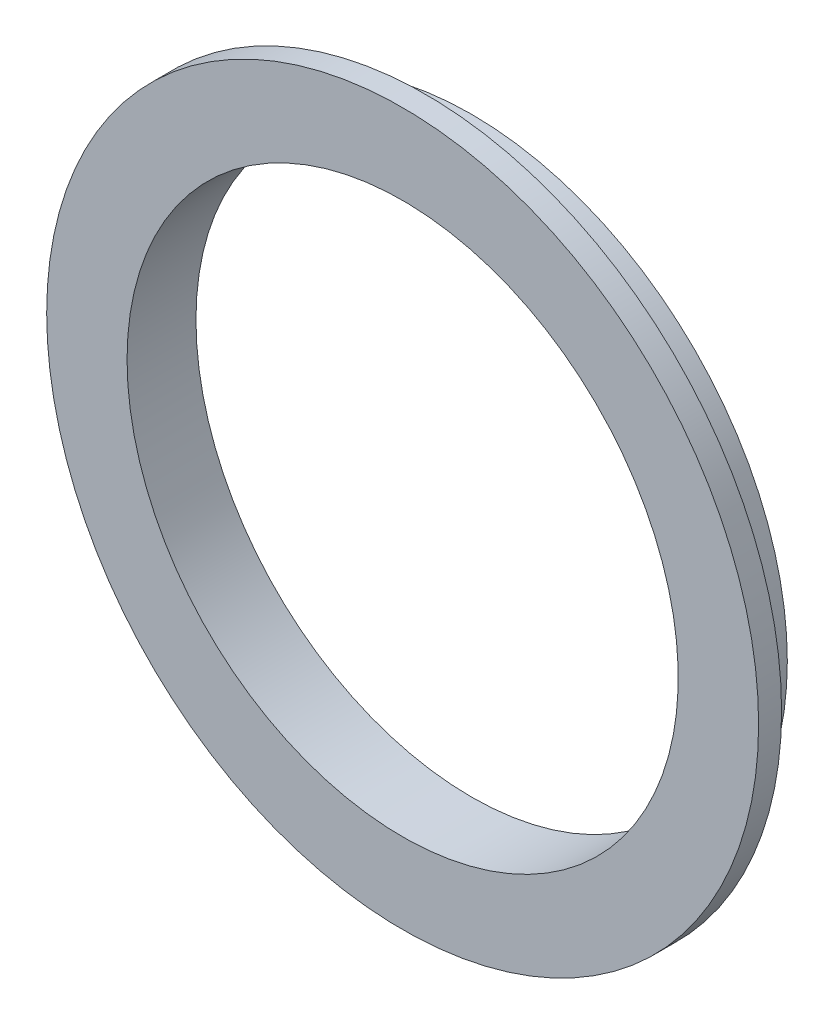
ISO-10303-21;
HEADER;
FILE_DESCRIPTION(('STEP AP214'),'2;1');
FILE_NAME('part.step','',(''),(''),'','','');
FILE_SCHEMA(('AUTOMOTIVE_DESIGN { 1 0 10303 214 1 1 1 1 }'));
ENDSEC;
DATA;
#1=APPLICATION_CONTEXT('core data for automotive mechanical design processes');
#2=APPLICATION_PROTOCOL_DEFINITION('international standard','automotive_design',2000,#1);
#3=PRODUCT_CONTEXT('',#1,'mechanical');
#4=PRODUCT('Part','Part','',(#3));
#5=PRODUCT_RELATED_PRODUCT_CATEGORY('part','',(#4));
#6=PRODUCT_DEFINITION_FORMATION('','',#4);
#7=PRODUCT_DEFINITION_CONTEXT('part definition',#1,'design');
#8=PRODUCT_DEFINITION('design','',#6,#7);
#9=PRODUCT_DEFINITION_SHAPE('','',#8);
#10=(LENGTH_UNIT() NAMED_UNIT(*) SI_UNIT(.MILLI.,.METRE.));
#11=(NAMED_UNIT(*) PLANE_ANGLE_UNIT() SI_UNIT($,.RADIAN.));
#12=(NAMED_UNIT(*) SI_UNIT($,.STERADIAN.) SOLID_ANGLE_UNIT());
#13=UNCERTAINTY_MEASURE_WITH_UNIT(LENGTH_MEASURE(1.E-05),#10,'distance_accuracy_value','');
#14=(GEOMETRIC_REPRESENTATION_CONTEXT(3) GLOBAL_UNCERTAINTY_ASSIGNED_CONTEXT((#13)) GLOBAL_UNIT_ASSIGNED_CONTEXT((#10,
#11,#12)) REPRESENTATION_CONTEXT('',''));
#15=CARTESIAN_POINT('',(0.,0.,0.));
#16=DIRECTION('',(0.,0.,1.));
#17=DIRECTION('',(1.,0.,0.));
#18=AXIS2_PLACEMENT_3D('',#15,#16,#17);
#19=CARTESIAN_POINT('',(0.,0.,0.));
#20=DIRECTION('',(0.,0.,1.));
#21=DIRECTION('',(1.,0.,0.));
#22=AXIS2_PLACEMENT_3D('',#19,#20,#21);
#23=PLANE('',#22);
#24=CARTESIAN_POINT('',(0.,0.,0.));
#25=DIRECTION('',(0.,0.,1.));
#26=DIRECTION('',(1.,0.,0.));
#27=AXIS2_PLACEMENT_3D('',#24,#25,#26);
#28=CIRCLE('',#27,27.5);
#29=CARTESIAN_POINT('',(27.5,0.,0.));
#30=VERTEX_POINT('',#29);
#31=EDGE_CURVE('E41',#30,#30,#28,.T.);
#32=ORIENTED_EDGE('',*,*,#31,.F.);
#33=EDGE_LOOP('',(#32));
#34=FACE_BOUND('',#33,.T.);
#35=CARTESIAN_POINT('',(0.,0.,0.));
#36=DIRECTION('',(0.,0.,1.));
#37=DIRECTION('',(1.,0.,0.));
#38=AXIS2_PLACEMENT_3D('',#35,#36,#37);
#39=CIRCLE('',#38,24.);
#40=CARTESIAN_POINT('',(24.,0.,0.));
#41=VERTEX_POINT('',#40);
#42=EDGE_CURVE('E50',#41,#41,#39,.T.);
#43=ORIENTED_EDGE('',*,*,#42,.T.);
#44=EDGE_LOOP('',(#43));
#45=FACE_BOUND('',#44,.T.);
#46=ADVANCED_FACE('F37',(#34,#45),#23,.F.);
#47=CARTESIAN_POINT('',(0.,0.,4.));
#48=DIRECTION('',(0.,0.,-1.));
#49=DIRECTION('',(-1.,0.,0.));
#50=AXIS2_PLACEMENT_3D('',#47,#48,#49);
#51=CYLINDRICAL_SURFACE('',#50,27.5);
#52=CARTESIAN_POINT('',(0.,0.,4.));
#53=DIRECTION('',(0.,0.,1.));
#54=DIRECTION('',(1.,0.,0.));
#55=AXIS2_PLACEMENT_3D('',#52,#53,#54);
#56=CIRCLE('',#55,27.5);
#57=CARTESIAN_POINT('',(27.5,0.,4.));
#58=VERTEX_POINT('',#57);
#59=EDGE_CURVE('E10',#58,#58,#56,.T.);
#60=ORIENTED_EDGE('',*,*,#59,.F.);
#61=EDGE_LOOP('',(#60));
#62=FACE_BOUND('',#61,.T.);
#63=ORIENTED_EDGE('',*,*,#31,.T.);
#64=EDGE_LOOP('',(#63));
#65=FACE_BOUND('',#64,.T.);
#66=ADVANCED_FACE('F39',(#62,#65),#51,.T.);
#67=CARTESIAN_POINT('',(0.,0.,4.));
#68=DIRECTION('',(0.,0.,-1.));
#69=DIRECTION('',(-1.,0.,0.));
#70=AXIS2_PLACEMENT_3D('',#67,#68,#69);
#71=CYLINDRICAL_SURFACE('',#70,24.);
#72=ORIENTED_EDGE('',*,*,#42,.F.);
#73=EDGE_LOOP('',(#72));
#74=FACE_BOUND('',#73,.T.);
#75=CARTESIAN_POINT('',(0.,0.,6.));
#76=DIRECTION('',(0.,0.,-1.));
#77=DIRECTION('',(-1.,0.,0.));
#78=AXIS2_PLACEMENT_3D('',#75,#76,#77);
#79=CIRCLE('',#78,24.);
#80=CARTESIAN_POINT('',(-24.,0.,6.));
#81=VERTEX_POINT('',#80);
#82=EDGE_CURVE('E60',#81,#81,#79,.T.);
#83=ORIENTED_EDGE('',*,*,#82,.F.);
#84=EDGE_LOOP('',(#83));
#85=FACE_BOUND('',#84,.T.);
#86=ADVANCED_FACE('F71',(#74,#85),#71,.F.);
#87=CARTESIAN_POINT('',(0.,0.,6.));
#88=DIRECTION('',(0.,0.,-1.));
#89=DIRECTION('',(-1.,0.,0.));
#90=AXIS2_PLACEMENT_3D('',#87,#88,#89);
#91=CYLINDRICAL_SURFACE('',#90,31.);
#92=CARTESIAN_POINT('',(0.,0.,6.));
#93=DIRECTION('',(0.,0.,1.));
#94=DIRECTION('',(1.,0.,0.));
#95=AXIS2_PLACEMENT_3D('',#92,#93,#94);
#96=CIRCLE('',#95,31.);
#97=CARTESIAN_POINT('',(31.,0.,6.));
#98=VERTEX_POINT('',#97);
#99=EDGE_CURVE('E55',#98,#98,#96,.T.);
#100=ORIENTED_EDGE('',*,*,#99,.F.);
#101=EDGE_LOOP('',(#100));
#102=FACE_BOUND('',#101,.T.);
#103=CARTESIAN_POINT('',(0.,0.,4.));
#104=DIRECTION('',(0.,0.,1.));
#105=DIRECTION('',(1.,0.,0.));
#106=AXIS2_PLACEMENT_3D('',#103,#104,#105);
#107=CIRCLE('',#106,31.);
#108=CARTESIAN_POINT('',(31.,0.,4.));
#109=VERTEX_POINT('',#108);
#110=EDGE_CURVE('E56',#109,#109,#107,.T.);
#111=ORIENTED_EDGE('',*,*,#110,.T.);
#112=EDGE_LOOP('',(#111));
#113=FACE_BOUND('',#112,.T.);
#114=ADVANCED_FACE('F73',(#102,#113),#91,.T.);
#115=CARTESIAN_POINT('',(0.,0.,6.));
#116=DIRECTION('',(0.,0.,1.));
#117=DIRECTION('',(1.,0.,0.));
#118=AXIS2_PLACEMENT_3D('',#115,#116,#117);
#119=PLANE('',#118);
#120=ORIENTED_EDGE('',*,*,#82,.T.);
#121=EDGE_LOOP('',(#120));
#122=FACE_BOUND('',#121,.T.);
#123=ORIENTED_EDGE('',*,*,#99,.T.);
#124=EDGE_LOOP('',(#123));
#125=FACE_BOUND('',#124,.T.);
#126=ADVANCED_FACE('F68',(#122,#125),#119,.T.);
#127=CARTESIAN_POINT('',(0.,0.,4.));
#128=DIRECTION('',(0.,0.,1.));
#129=DIRECTION('',(1.,0.,0.));
#130=AXIS2_PLACEMENT_3D('',#127,#128,#129);
#131=PLANE('',#130);
#132=ORIENTED_EDGE('',*,*,#59,.T.);
#133=EDGE_LOOP('',(#132));
#134=FACE_BOUND('',#133,.T.);
#135=ORIENTED_EDGE('',*,*,#110,.F.);
#136=EDGE_LOOP('',(#135));
#137=FACE_BOUND('',#136,.T.);
#138=ADVANCED_FACE('F109',(#134,#137),#131,.F.);
#139=CLOSED_SHELL('',(#46,#66,#86,#114,#126,#138));
#140=MANIFOLD_SOLID_BREP('B2',#139);
#141=ADVANCED_BREP_SHAPE_REPRESENTATION('',(#18,#140),#14);
#142=SHAPE_DEFINITION_REPRESENTATION(#9,#141);
ENDSEC;
END-ISO-10303-21;
